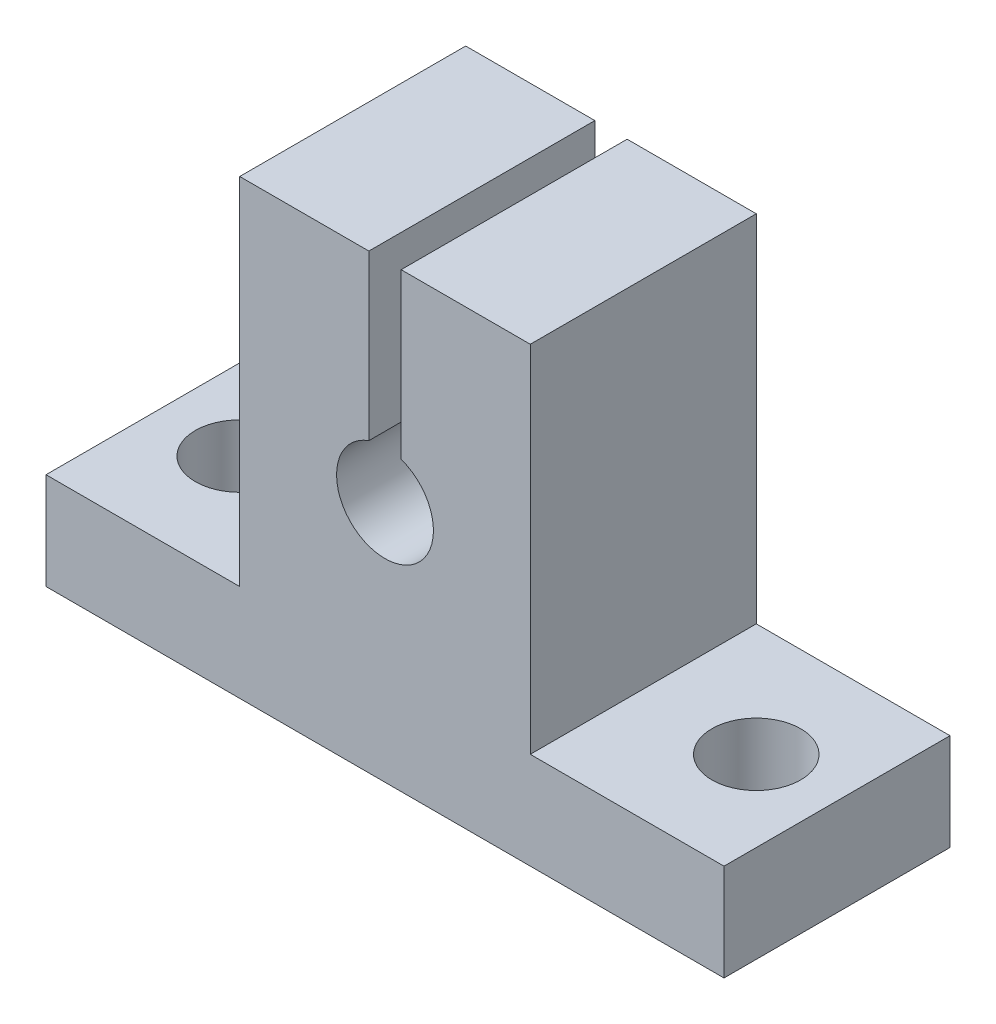
ISO-10303-21;
HEADER;
FILE_DESCRIPTION(('STEP AP214'),'2;1');
FILE_NAME('part.step','',(''),(''),'','','');
FILE_SCHEMA(('AUTOMOTIVE_DESIGN { 1 0 10303 214 1 1 1 1 }'));
ENDSEC;
DATA;
#1=APPLICATION_CONTEXT('core data for automotive mechanical design processes');
#2=APPLICATION_PROTOCOL_DEFINITION('international standard','automotive_design',2000,#1);
#3=PRODUCT_CONTEXT('',#1,'mechanical');
#4=PRODUCT('Part','Part','',(#3));
#5=PRODUCT_RELATED_PRODUCT_CATEGORY('part','',(#4));
#6=PRODUCT_DEFINITION_FORMATION('','',#4);
#7=PRODUCT_DEFINITION_CONTEXT('part definition',#1,'design');
#8=PRODUCT_DEFINITION('design','',#6,#7);
#9=PRODUCT_DEFINITION_SHAPE('','',#8);
#10=(LENGTH_UNIT() NAMED_UNIT(*) SI_UNIT(.MILLI.,.METRE.));
#11=(NAMED_UNIT(*) PLANE_ANGLE_UNIT() SI_UNIT($,.RADIAN.));
#12=(NAMED_UNIT(*) SI_UNIT($,.STERADIAN.) SOLID_ANGLE_UNIT());
#13=UNCERTAINTY_MEASURE_WITH_UNIT(LENGTH_MEASURE(1.E-05),#10,'distance_accuracy_value','');
#14=(GEOMETRIC_REPRESENTATION_CONTEXT(3) GLOBAL_UNCERTAINTY_ASSIGNED_CONTEXT((#13)) GLOBAL_UNIT_ASSIGNED_CONTEXT((#10,
#11,#12)) REPRESENTATION_CONTEXT('',''));
#15=CARTESIAN_POINT('',(0.,0.,0.));
#16=DIRECTION('',(0.,0.,1.));
#17=DIRECTION('',(1.,0.,0.));
#18=AXIS2_PLACEMENT_3D('',#15,#16,#17);
#19=CARTESIAN_POINT('',(-1.,0.,14.));
#20=DIRECTION('',(-1.,0.,0.));
#21=DIRECTION('',(0.,-1.,0.));
#22=AXIS2_PLACEMENT_3D('',#19,#20,#21);
#23=PLANE('',#22);
#24=DIRECTION('',(0.,1.,0.));
#25=VECTOR('',#24,1.);
#26=CARTESIAN_POINT('',(-1.,0.,0.));
#27=LINE('',#26,#25);
#28=CARTESIAN_POINT('',(-1.,-10.1715728752538,0.));
#29=VERTEX_POINT('',#28);
#30=CARTESIAN_POINT('',(-1.,0.,0.));
#31=VERTEX_POINT('',#30);
#32=EDGE_CURVE('E170',#29,#31,#27,.T.);
#33=ORIENTED_EDGE('',*,*,#32,.T.);
#34=DIRECTION('',(0.,0.,-1.));
#35=VECTOR('',#34,1.);
#36=CARTESIAN_POINT('',(-1.,0.,14.));
#37=LINE('',#36,#35);
#38=CARTESIAN_POINT('',(-1.,0.,14.));
#39=VERTEX_POINT('',#38);
#40=EDGE_CURVE('E11',#39,#31,#37,.T.);
#41=ORIENTED_EDGE('',*,*,#40,.F.);
#42=DIRECTION('',(0.,1.,0.));
#43=VECTOR('',#42,1.);
#44=CARTESIAN_POINT('',(-1.,0.,14.));
#45=LINE('',#44,#43);
#46=CARTESIAN_POINT('',(-1.,-10.1715728752538,14.));
#47=VERTEX_POINT('',#46);
#48=EDGE_CURVE('E205',#47,#39,#45,.T.);
#49=ORIENTED_EDGE('',*,*,#48,.F.);
#50=DIRECTION('',(0.,0.,-1.));
#51=VECTOR('',#50,1.);
#52=CARTESIAN_POINT('',(-1.,-10.1715728752538,14.));
#53=LINE('',#52,#51);
#54=EDGE_CURVE('E166',#47,#29,#53,.T.);
#55=ORIENTED_EDGE('',*,*,#54,.T.);
#56=EDGE_LOOP('',(#33,#41,#49,#55));
#57=FACE_BOUND('',#56,.T.);
#58=ADVANCED_FACE('F45',(#57),#23,.F.);
#59=CARTESIAN_POINT('',(-1.,0.,14.));
#60=DIRECTION('',(0.,-1.,0.));
#61=DIRECTION('',(1.,0.,0.));
#62=AXIS2_PLACEMENT_3D('',#59,#60,#61);
#63=PLANE('',#62);
#64=DIRECTION('',(-1.,0.,0.));
#65=VECTOR('',#64,1.);
#66=CARTESIAN_POINT('',(-1.,0.,0.));
#67=LINE('',#66,#65);
#68=CARTESIAN_POINT('',(-9.,0.,0.));
#69=VERTEX_POINT('',#68);
#70=EDGE_CURVE('E174',#31,#69,#67,.T.);
#71=ORIENTED_EDGE('',*,*,#70,.T.);
#72=DIRECTION('',(0.,0.,-1.));
#73=VECTOR('',#72,1.);
#74=CARTESIAN_POINT('',(-9.,0.,14.));
#75=LINE('',#74,#73);
#76=CARTESIAN_POINT('',(-9.,0.,14.));
#77=VERTEX_POINT('',#76);
#78=EDGE_CURVE('E54',#77,#69,#75,.T.);
#79=ORIENTED_EDGE('',*,*,#78,.F.);
#80=DIRECTION('',(-1.,0.,0.));
#81=VECTOR('',#80,1.);
#82=CARTESIAN_POINT('',(-1.,0.,14.));
#83=LINE('',#82,#81);
#84=EDGE_CURVE('E117',#39,#77,#83,.T.);
#85=ORIENTED_EDGE('',*,*,#84,.F.);
#86=ORIENTED_EDGE('',*,*,#40,.T.);
#87=EDGE_LOOP('',(#71,#79,#85,#86));
#88=FACE_BOUND('',#87,.T.);
#89=ADVANCED_FACE('F299',(#88),#63,.F.);
#90=CARTESIAN_POINT('',(-9.,0.,14.));
#91=DIRECTION('',(1.,0.,0.));
#92=DIRECTION('',(0.,1.,0.));
#93=AXIS2_PLACEMENT_3D('',#90,#91,#92);
#94=PLANE('',#93);
#95=DIRECTION('',(0.,-1.,0.));
#96=VECTOR('',#95,1.);
#97=CARTESIAN_POINT('',(-9.,0.,0.));
#98=LINE('',#97,#96);
#99=CARTESIAN_POINT('',(-9.,-22.,0.));
#100=VERTEX_POINT('',#99);
#101=EDGE_CURVE('E178',#69,#100,#98,.T.);
#102=ORIENTED_EDGE('',*,*,#101,.T.);
#103=DIRECTION('',(0.,0.,-1.));
#104=VECTOR('',#103,1.);
#105=CARTESIAN_POINT('',(-9.,-22.,14.));
#106=LINE('',#105,#104);
#107=CARTESIAN_POINT('',(-9.,-22.,14.));
#108=VERTEX_POINT('',#107);
#109=EDGE_CURVE('E232',#108,#100,#106,.T.);
#110=ORIENTED_EDGE('',*,*,#109,.F.);
#111=DIRECTION('',(0.,-1.,0.));
#112=VECTOR('',#111,1.);
#113=CARTESIAN_POINT('',(-9.,0.,14.));
#114=LINE('',#113,#112);
#115=EDGE_CURVE('E242',#77,#108,#114,.T.);
#116=ORIENTED_EDGE('',*,*,#115,.F.);
#117=ORIENTED_EDGE('',*,*,#78,.T.);
#118=EDGE_LOOP('',(#102,#110,#116,#117));
#119=FACE_BOUND('',#118,.T.);
#120=ADVANCED_FACE('F240',(#119),#94,.F.);
#121=CARTESIAN_POINT('',(-9.,-22.,14.));
#122=DIRECTION('',(0.,-1.,0.));
#123=DIRECTION('',(1.,0.,0.));
#124=AXIS2_PLACEMENT_3D('',#121,#122,#123);
#125=PLANE('',#124);
#126=CARTESIAN_POINT('',(-16.,-22.,7.));
#127=DIRECTION('',(0.,1.,0.));
#128=DIRECTION('',(-1.,0.,0.));
#129=AXIS2_PLACEMENT_3D('',#126,#127,#128);
#130=CIRCLE('',#129,2.75);
#131=CARTESIAN_POINT('',(-18.75,-22.,7.));
#132=VERTEX_POINT('',#131);
#133=EDGE_CURVE('E382',#132,#132,#130,.T.);
#134=ORIENTED_EDGE('',*,*,#133,.F.);
#135=EDGE_LOOP('',(#134));
#136=FACE_BOUND('',#135,.T.);
#137=DIRECTION('',(-1.,0.,0.));
#138=VECTOR('',#137,1.);
#139=CARTESIAN_POINT('',(-9.,-22.,0.));
#140=LINE('',#139,#138);
#141=CARTESIAN_POINT('',(-21.,-22.,0.));
#142=VERTEX_POINT('',#141);
#143=EDGE_CURVE('E181',#100,#142,#140,.T.);
#144=ORIENTED_EDGE('',*,*,#143,.T.);
#145=DIRECTION('',(0.,0.,-1.));
#146=VECTOR('',#145,1.);
#147=CARTESIAN_POINT('',(-21.,-22.,14.));
#148=LINE('',#147,#146);
#149=CARTESIAN_POINT('',(-21.,-22.,14.));
#150=VERTEX_POINT('',#149);
#151=EDGE_CURVE('E228',#150,#142,#148,.T.);
#152=ORIENTED_EDGE('',*,*,#151,.F.);
#153=DIRECTION('',(-1.,0.,0.));
#154=VECTOR('',#153,1.);
#155=CARTESIAN_POINT('',(-9.,-22.,14.));
#156=LINE('',#155,#154);
#157=EDGE_CURVE('E261',#108,#150,#156,.T.);
#158=ORIENTED_EDGE('',*,*,#157,.F.);
#159=ORIENTED_EDGE('',*,*,#109,.T.);
#160=EDGE_LOOP('',(#144,#152,#158,#159));
#161=FACE_BOUND('',#160,.T.);
#162=ADVANCED_FACE('F251',(#136,#161),#125,.F.);
#163=CARTESIAN_POINT('',(-21.,-22.,14.));
#164=DIRECTION('',(1.,0.,0.));
#165=DIRECTION('',(0.,0.,-1.));
#166=AXIS2_PLACEMENT_3D('',#163,#164,#165);
#167=PLANE('',#166);
#168=DIRECTION('',(0.,-1.,0.));
#169=VECTOR('',#168,1.);
#170=CARTESIAN_POINT('',(-21.,-22.,0.));
#171=LINE('',#170,#169);
#172=CARTESIAN_POINT('',(-21.,-28.,0.));
#173=VERTEX_POINT('',#172);
#174=EDGE_CURVE('E184',#142,#173,#171,.T.);
#175=ORIENTED_EDGE('',*,*,#174,.T.);
#176=DIRECTION('',(0.,0.,-1.));
#177=VECTOR('',#176,1.);
#178=CARTESIAN_POINT('',(-21.,-28.,14.));
#179=LINE('',#178,#177);
#180=CARTESIAN_POINT('',(-21.,-28.,14.));
#181=VERTEX_POINT('',#180);
#182=EDGE_CURVE('E224',#181,#173,#179,.T.);
#183=ORIENTED_EDGE('',*,*,#182,.F.);
#184=DIRECTION('',(0.,-1.,0.));
#185=VECTOR('',#184,1.);
#186=CARTESIAN_POINT('',(-21.,-22.,14.));
#187=LINE('',#186,#185);
#188=EDGE_CURVE('E257',#150,#181,#187,.T.);
#189=ORIENTED_EDGE('',*,*,#188,.F.);
#190=ORIENTED_EDGE('',*,*,#151,.T.);
#191=EDGE_LOOP('',(#175,#183,#189,#190));
#192=FACE_BOUND('',#191,.T.);
#193=ADVANCED_FACE('F255',(#192),#167,.F.);
#194=CARTESIAN_POINT('',(-21.,-28.,14.));
#195=DIRECTION('',(0.,1.,0.));
#196=DIRECTION('',(0.,0.,1.));
#197=AXIS2_PLACEMENT_3D('',#194,#195,#196);
#198=PLANE('',#197);
#199=CARTESIAN_POINT('',(-16.,-28.,7.));
#200=DIRECTION('',(0.,1.,0.));
#201=DIRECTION('',(-1.,0.,0.));
#202=AXIS2_PLACEMENT_3D('',#199,#200,#201);
#203=CIRCLE('',#202,2.75);
#204=CARTESIAN_POINT('',(-18.75,-28.,7.));
#205=VERTEX_POINT('',#204);
#206=EDGE_CURVE('E175',#205,#205,#203,.T.);
#207=ORIENTED_EDGE('',*,*,#206,.T.);
#208=EDGE_LOOP('',(#207));
#209=FACE_BOUND('',#208,.T.);
#210=CARTESIAN_POINT('',(16.,-28.,7.00000000000001));
#211=DIRECTION('',(0.,1.,0.));
#212=DIRECTION('',(1.,0.,0.));
#213=AXIS2_PLACEMENT_3D('',#210,#211,#212);
#214=CIRCLE('',#213,2.75);
#215=CARTESIAN_POINT('',(13.25,-28.,7.00000000000001));
#216=VERTEX_POINT('',#215);
#217=EDGE_CURVE('E390',#216,#216,#214,.T.);
#218=ORIENTED_EDGE('',*,*,#217,.T.);
#219=EDGE_LOOP('',(#218));
#220=FACE_BOUND('',#219,.T.);
#221=DIRECTION('',(1.,0.,0.));
#222=VECTOR('',#221,1.);
#223=CARTESIAN_POINT('',(-21.,-28.,0.));
#224=LINE('',#223,#222);
#225=CARTESIAN_POINT('',(21.,-28.,0.));
#226=VERTEX_POINT('',#225);
#227=EDGE_CURVE('E187',#173,#226,#224,.T.);
#228=ORIENTED_EDGE('',*,*,#227,.T.);
#229=DIRECTION('',(0.,0.,-1.));
#230=VECTOR('',#229,1.);
#231=CARTESIAN_POINT('',(21.,-28.,14.));
#232=LINE('',#231,#230);
#233=CARTESIAN_POINT('',(21.,-28.,14.));
#234=VERTEX_POINT('',#233);
#235=EDGE_CURVE('E220',#234,#226,#232,.T.);
#236=ORIENTED_EDGE('',*,*,#235,.F.);
#237=DIRECTION('',(1.,0.,0.));
#238=VECTOR('',#237,1.);
#239=CARTESIAN_POINT('',(-21.,-28.,14.));
#240=LINE('',#239,#238);
#241=EDGE_CURVE('E260',#181,#234,#240,.T.);
#242=ORIENTED_EDGE('',*,*,#241,.F.);
#243=ORIENTED_EDGE('',*,*,#182,.T.);
#244=EDGE_LOOP('',(#228,#236,#242,#243));
#245=FACE_BOUND('',#244,.T.);
#246=ADVANCED_FACE('F313',(#209,#220,#245),#198,.F.);
#247=CARTESIAN_POINT('',(21.,-22.,14.));
#248=DIRECTION('',(-1.,0.,0.));
#249=DIRECTION('',(0.,0.,1.));
#250=AXIS2_PLACEMENT_3D('',#247,#248,#249);
#251=PLANE('',#250);
#252=DIRECTION('',(0.,1.,0.));
#253=VECTOR('',#252,1.);
#254=CARTESIAN_POINT('',(21.,-22.,0.));
#255=LINE('',#254,#253);
#256=CARTESIAN_POINT('',(21.,-22.,0.));
#257=VERTEX_POINT('',#256);
#258=EDGE_CURVE('E190',#226,#257,#255,.T.);
#259=ORIENTED_EDGE('',*,*,#258,.T.);
#260=DIRECTION('',(0.,0.,-1.));
#261=VECTOR('',#260,1.);
#262=CARTESIAN_POINT('',(21.,-22.,14.));
#263=LINE('',#262,#261);
#264=CARTESIAN_POINT('',(21.,-22.,14.));
#265=VERTEX_POINT('',#264);
#266=EDGE_CURVE('E216',#265,#257,#263,.T.);
#267=ORIENTED_EDGE('',*,*,#266,.F.);
#268=DIRECTION('',(0.,1.,0.));
#269=VECTOR('',#268,1.);
#270=CARTESIAN_POINT('',(21.,-22.,14.));
#271=LINE('',#270,#269);
#272=EDGE_CURVE('E265',#234,#265,#271,.T.);
#273=ORIENTED_EDGE('',*,*,#272,.F.);
#274=ORIENTED_EDGE('',*,*,#235,.T.);
#275=EDGE_LOOP('',(#259,#267,#273,#274));
#276=FACE_BOUND('',#275,.T.);
#277=ADVANCED_FACE('F316',(#276),#251,.F.);
#278=CARTESIAN_POINT('',(9.,-22.,14.));
#279=DIRECTION('',(0.,-1.,0.));
#280=DIRECTION('',(1.,0.,0.));
#281=AXIS2_PLACEMENT_3D('',#278,#279,#280);
#282=PLANE('',#281);
#283=CARTESIAN_POINT('',(16.,-22.,7.00000000000001));
#284=DIRECTION('',(0.,1.,0.));
#285=DIRECTION('',(1.,0.,0.));
#286=AXIS2_PLACEMENT_3D('',#283,#284,#285);
#287=CIRCLE('',#286,2.75);
#288=CARTESIAN_POINT('',(13.25,-22.,7.00000000000001));
#289=VERTEX_POINT('',#288);
#290=EDGE_CURVE('E384',#289,#289,#287,.T.);
#291=ORIENTED_EDGE('',*,*,#290,.F.);
#292=EDGE_LOOP('',(#291));
#293=FACE_BOUND('',#292,.T.);
#294=DIRECTION('',(-1.,0.,0.));
#295=VECTOR('',#294,1.);
#296=CARTESIAN_POINT('',(9.,-22.,0.));
#297=LINE('',#296,#295);
#298=CARTESIAN_POINT('',(9.,-22.,0.));
#299=VERTEX_POINT('',#298);
#300=EDGE_CURVE('E193',#257,#299,#297,.T.);
#301=ORIENTED_EDGE('',*,*,#300,.T.);
#302=DIRECTION('',(0.,0.,-1.));
#303=VECTOR('',#302,1.);
#304=CARTESIAN_POINT('',(9.,-22.,14.));
#305=LINE('',#304,#303);
#306=CARTESIAN_POINT('',(9.,-22.,14.));
#307=VERTEX_POINT('',#306);
#308=EDGE_CURVE('E212',#307,#299,#305,.T.);
#309=ORIENTED_EDGE('',*,*,#308,.F.);
#310=DIRECTION('',(-1.,0.,0.));
#311=VECTOR('',#310,1.);
#312=CARTESIAN_POINT('',(9.,-22.,14.));
#313=LINE('',#312,#311);
#314=EDGE_CURVE('E272',#265,#307,#313,.T.);
#315=ORIENTED_EDGE('',*,*,#314,.F.);
#316=ORIENTED_EDGE('',*,*,#266,.T.);
#317=EDGE_LOOP('',(#301,#309,#315,#316));
#318=FACE_BOUND('',#317,.T.);
#319=ADVANCED_FACE('F280',(#293,#318),#282,.F.);
#320=CARTESIAN_POINT('',(9.,0.,14.));
#321=DIRECTION('',(-1.,0.,0.));
#322=DIRECTION('',(0.,-1.,0.));
#323=AXIS2_PLACEMENT_3D('',#320,#321,#322);
#324=PLANE('',#323);
#325=DIRECTION('',(0.,1.,0.));
#326=VECTOR('',#325,1.);
#327=CARTESIAN_POINT('',(9.,0.,0.));
#328=LINE('',#327,#326);
#329=CARTESIAN_POINT('',(9.,0.,0.));
#330=VERTEX_POINT('',#329);
#331=EDGE_CURVE('E196',#299,#330,#328,.T.);
#332=ORIENTED_EDGE('',*,*,#331,.T.);
#333=DIRECTION('',(0.,0.,-1.));
#334=VECTOR('',#333,1.);
#335=CARTESIAN_POINT('',(9.,0.,14.));
#336=LINE('',#335,#334);
#337=CARTESIAN_POINT('',(9.,0.,14.));
#338=VERTEX_POINT('',#337);
#339=EDGE_CURVE('E159',#338,#330,#336,.T.);
#340=ORIENTED_EDGE('',*,*,#339,.F.);
#341=DIRECTION('',(0.,1.,0.));
#342=VECTOR('',#341,1.);
#343=CARTESIAN_POINT('',(9.,0.,14.));
#344=LINE('',#343,#342);
#345=EDGE_CURVE('E148',#307,#338,#344,.T.);
#346=ORIENTED_EDGE('',*,*,#345,.F.);
#347=ORIENTED_EDGE('',*,*,#308,.T.);
#348=EDGE_LOOP('',(#332,#340,#346,#347));
#349=FACE_BOUND('',#348,.T.);
#350=ADVANCED_FACE('F284',(#349),#324,.F.);
#351=CARTESIAN_POINT('',(1.,0.,14.));
#352=DIRECTION('',(0.,-1.,0.));
#353=DIRECTION('',(1.,0.,0.));
#354=AXIS2_PLACEMENT_3D('',#351,#352,#353);
#355=PLANE('',#354);
#356=DIRECTION('',(-1.,0.,0.));
#357=VECTOR('',#356,1.);
#358=CARTESIAN_POINT('',(1.,0.,0.));
#359=LINE('',#358,#357);
#360=CARTESIAN_POINT('',(1.,0.,0.));
#361=VERTEX_POINT('',#360);
#362=EDGE_CURVE('E157',#330,#361,#359,.T.);
#363=ORIENTED_EDGE('',*,*,#362,.T.);
#364=DIRECTION('',(0.,0.,-1.));
#365=VECTOR('',#364,1.);
#366=CARTESIAN_POINT('',(1.,0.,14.));
#367=LINE('',#366,#365);
#368=CARTESIAN_POINT('',(1.,0.,14.));
#369=VERTEX_POINT('',#368);
#370=EDGE_CURVE('E154',#369,#361,#367,.T.);
#371=ORIENTED_EDGE('',*,*,#370,.F.);
#372=DIRECTION('',(-1.,0.,0.));
#373=VECTOR('',#372,1.);
#374=CARTESIAN_POINT('',(1.,0.,14.));
#375=LINE('',#374,#373);
#376=EDGE_CURVE('E142',#338,#369,#375,.T.);
#377=ORIENTED_EDGE('',*,*,#376,.F.);
#378=ORIENTED_EDGE('',*,*,#339,.T.);
#379=EDGE_LOOP('',(#363,#371,#377,#378));
#380=FACE_BOUND('',#379,.T.);
#381=ADVANCED_FACE('F155',(#380),#355,.F.);
#382=CARTESIAN_POINT('',(1.,0.,14.));
#383=DIRECTION('',(1.,0.,0.));
#384=DIRECTION('',(0.,1.,0.));
#385=AXIS2_PLACEMENT_3D('',#382,#383,#384);
#386=PLANE('',#385);
#387=DIRECTION('',(0.,-1.,0.));
#388=VECTOR('',#387,1.);
#389=CARTESIAN_POINT('',(1.,0.,0.));
#390=LINE('',#389,#388);
#391=CARTESIAN_POINT('',(1.,-10.1715728752538,0.));
#392=VERTEX_POINT('',#391);
#393=EDGE_CURVE('E103',#361,#392,#390,.T.);
#394=ORIENTED_EDGE('',*,*,#393,.T.);
#395=DIRECTION('',(0.,0.,-1.));
#396=VECTOR('',#395,1.);
#397=CARTESIAN_POINT('',(1.,-10.1715728752538,14.));
#398=LINE('',#397,#396);
#399=CARTESIAN_POINT('',(1.,-10.1715728752538,14.));
#400=VERTEX_POINT('',#399);
#401=EDGE_CURVE('E160',#400,#392,#398,.T.);
#402=ORIENTED_EDGE('',*,*,#401,.F.);
#403=DIRECTION('',(0.,-1.,0.));
#404=VECTOR('',#403,1.);
#405=CARTESIAN_POINT('',(1.,0.,14.));
#406=LINE('',#405,#404);
#407=EDGE_CURVE('E146',#369,#400,#406,.T.);
#408=ORIENTED_EDGE('',*,*,#407,.F.);
#409=ORIENTED_EDGE('',*,*,#370,.T.);
#410=EDGE_LOOP('',(#394,#402,#408,#409));
#411=FACE_BOUND('',#410,.T.);
#412=ADVANCED_FACE('F162',(#411),#386,.F.);
#413=CARTESIAN_POINT('',(0.,-13.,14.));
#414=DIRECTION('',(0.,0.,-1.));
#415=DIRECTION('',(-1.,0.,0.));
#416=AXIS2_PLACEMENT_3D('',#413,#414,#415);
#417=CYLINDRICAL_SURFACE('',#416,3.);
#418=CARTESIAN_POINT('',(0.,-13.,0.));
#419=DIRECTION('',(0.,0.,-1.));
#420=DIRECTION('',(1.,0.,0.));
#421=AXIS2_PLACEMENT_3D('',#418,#419,#420);
#422=CIRCLE('',#421,3.);
#423=EDGE_CURVE('E109',#392,#29,#422,.T.);
#424=ORIENTED_EDGE('',*,*,#423,.T.);
#425=ORIENTED_EDGE('',*,*,#54,.F.);
#426=CARTESIAN_POINT('',(0.,-13.,14.));
#427=DIRECTION('',(0.,0.,-1.));
#428=DIRECTION('',(1.,0.,0.));
#429=AXIS2_PLACEMENT_3D('',#426,#427,#428);
#430=CIRCLE('',#429,3.);
#431=EDGE_CURVE('E62',#400,#47,#430,.T.);
#432=ORIENTED_EDGE('',*,*,#431,.F.);
#433=ORIENTED_EDGE('',*,*,#401,.T.);
#434=EDGE_LOOP('',(#424,#425,#432,#433));
#435=FACE_BOUND('',#434,.T.);
#436=ADVANCED_FACE('F288',(#435),#417,.F.);
#437=CARTESIAN_POINT('',(0.,-13.,14.));
#438=DIRECTION('',(0.,0.,1.));
#439=DIRECTION('',(1.,0.,0.));
#440=AXIS2_PLACEMENT_3D('',#437,#438,#439);
#441=PLANE('',#440);
#442=ORIENTED_EDGE('',*,*,#48,.T.);
#443=ORIENTED_EDGE('',*,*,#84,.T.);
#444=ORIENTED_EDGE('',*,*,#115,.T.);
#445=ORIENTED_EDGE('',*,*,#157,.T.);
#446=ORIENTED_EDGE('',*,*,#188,.T.);
#447=ORIENTED_EDGE('',*,*,#241,.T.);
#448=ORIENTED_EDGE('',*,*,#272,.T.);
#449=ORIENTED_EDGE('',*,*,#314,.T.);
#450=ORIENTED_EDGE('',*,*,#345,.T.);
#451=ORIENTED_EDGE('',*,*,#376,.T.);
#452=ORIENTED_EDGE('',*,*,#407,.T.);
#453=ORIENTED_EDGE('',*,*,#431,.T.);
#454=EDGE_LOOP('',(#442,#443,#444,#445,#446,#447,#448,#449,#450,#451,#452,#453));
#455=FACE_BOUND('',#454,.T.);
#456=ADVANCED_FACE('F144',(#455),#441,.T.);
#457=CARTESIAN_POINT('',(0.,-13.,0.));
#458=DIRECTION('',(0.,0.,1.));
#459=DIRECTION('',(1.,0.,0.));
#460=AXIS2_PLACEMENT_3D('',#457,#458,#459);
#461=PLANE('',#460);
#462=ORIENTED_EDGE('',*,*,#32,.F.);
#463=ORIENTED_EDGE('',*,*,#423,.F.);
#464=ORIENTED_EDGE('',*,*,#393,.F.);
#465=ORIENTED_EDGE('',*,*,#362,.F.);
#466=ORIENTED_EDGE('',*,*,#331,.F.);
#467=ORIENTED_EDGE('',*,*,#300,.F.);
#468=ORIENTED_EDGE('',*,*,#258,.F.);
#469=ORIENTED_EDGE('',*,*,#227,.F.);
#470=ORIENTED_EDGE('',*,*,#174,.F.);
#471=ORIENTED_EDGE('',*,*,#143,.F.);
#472=ORIENTED_EDGE('',*,*,#101,.F.);
#473=ORIENTED_EDGE('',*,*,#70,.F.);
#474=EDGE_LOOP('',(#462,#463,#464,#465,#466,#467,#468,#469,#470,#471,#472,#473));
#475=FACE_BOUND('',#474,.T.);
#476=ADVANCED_FACE('F246',(#475),#461,.F.);
#477=CARTESIAN_POINT('',(16.,-28.,7.00000000000001));
#478=DIRECTION('',(0.,1.,0.));
#479=DIRECTION('',(-1.,0.,0.));
#480=AXIS2_PLACEMENT_3D('',#477,#478,#479);
#481=CYLINDRICAL_SURFACE('',#480,2.75);
#482=CARTESIAN_POINT('',(13.25,-28.,7.00000000000001));
#483=CARTESIAN_POINT('',(13.25,-27.9375,7.00000000000001));
#484=CARTESIAN_POINT('',(13.25,-27.875,7.00000000000001));
#485=CARTESIAN_POINT('',(13.25,-27.75,7.00000000000001));
#486=CARTESIAN_POINT('',(13.25,-27.6875,7.00000000000001));
#487=CARTESIAN_POINT('',(13.25,-27.5625,7.00000000000001));
#488=CARTESIAN_POINT('',(13.25,-27.5,7.00000000000001));
#489=CARTESIAN_POINT('',(13.25,-27.375,7.00000000000001));
#490=CARTESIAN_POINT('',(13.25,-27.3125,7.00000000000001));
#491=CARTESIAN_POINT('',(13.25,-27.1875,7.00000000000001));
#492=CARTESIAN_POINT('',(13.25,-27.125,7.00000000000001));
#493=CARTESIAN_POINT('',(13.25,-27.,7.00000000000001));
#494=CARTESIAN_POINT('',(13.25,-26.9375,7.00000000000001));
#495=CARTESIAN_POINT('',(13.25,-26.8125,7.00000000000001));
#496=CARTESIAN_POINT('',(13.25,-26.75,7.00000000000001));
#497=CARTESIAN_POINT('',(13.25,-26.625,7.00000000000001));
#498=CARTESIAN_POINT('',(13.25,-26.5625,7.00000000000001));
#499=CARTESIAN_POINT('',(13.25,-26.4375,7.00000000000001));
#500=CARTESIAN_POINT('',(13.25,-26.375,7.00000000000001));
#501=CARTESIAN_POINT('',(13.25,-26.25,7.00000000000001));
#502=CARTESIAN_POINT('',(13.25,-26.1875,7.00000000000001));
#503=CARTESIAN_POINT('',(13.25,-26.0625,7.00000000000001));
#504=CARTESIAN_POINT('',(13.25,-26.,7.00000000000001));
#505=CARTESIAN_POINT('',(13.25,-25.875,7.00000000000001));
#506=CARTESIAN_POINT('',(13.25,-25.8125,7.00000000000001));
#507=CARTESIAN_POINT('',(13.25,-25.6875,7.00000000000001));
#508=CARTESIAN_POINT('',(13.25,-25.625,7.00000000000001));
#509=CARTESIAN_POINT('',(13.25,-25.5,7.00000000000001));
#510=CARTESIAN_POINT('',(13.25,-25.4375,7.00000000000001));
#511=CARTESIAN_POINT('',(13.25,-25.3125,7.00000000000001));
#512=CARTESIAN_POINT('',(13.25,-25.25,7.00000000000001));
#513=CARTESIAN_POINT('',(13.25,-25.125,7.00000000000001));
#514=CARTESIAN_POINT('',(13.25,-25.0625,7.00000000000001));
#515=CARTESIAN_POINT('',(13.25,-24.9375,7.00000000000001));
#516=CARTESIAN_POINT('',(13.25,-24.875,7.00000000000001));
#517=CARTESIAN_POINT('',(13.25,-24.75,7.00000000000001));
#518=CARTESIAN_POINT('',(13.25,-24.6875,7.00000000000001));
#519=CARTESIAN_POINT('',(13.25,-24.5625,7.00000000000001));
#520=CARTESIAN_POINT('',(13.25,-24.5,7.00000000000001));
#521=CARTESIAN_POINT('',(13.25,-24.375,7.00000000000001));
#522=CARTESIAN_POINT('',(13.25,-24.3125,7.00000000000001));
#523=CARTESIAN_POINT('',(13.25,-24.1875,7.00000000000001));
#524=CARTESIAN_POINT('',(13.25,-24.125,7.00000000000001));
#525=CARTESIAN_POINT('',(13.25,-24.,7.00000000000001));
#526=CARTESIAN_POINT('',(13.25,-23.9375,7.00000000000001));
#527=CARTESIAN_POINT('',(13.25,-23.8125,7.00000000000001));
#528=CARTESIAN_POINT('',(13.25,-23.75,7.00000000000001));
#529=CARTESIAN_POINT('',(13.25,-23.625,7.00000000000001));
#530=CARTESIAN_POINT('',(13.25,-23.5625,7.00000000000001));
#531=CARTESIAN_POINT('',(13.25,-23.4375,7.00000000000001));
#532=CARTESIAN_POINT('',(13.25,-23.375,7.00000000000001));
#533=CARTESIAN_POINT('',(13.25,-23.25,7.00000000000001));
#534=CARTESIAN_POINT('',(13.25,-23.1875,7.00000000000001));
#535=CARTESIAN_POINT('',(13.25,-23.0625,7.00000000000001));
#536=CARTESIAN_POINT('',(13.25,-23.,7.00000000000001));
#537=CARTESIAN_POINT('',(13.25,-22.875,7.00000000000001));
#538=CARTESIAN_POINT('',(13.25,-22.8125,7.00000000000001));
#539=CARTESIAN_POINT('',(13.25,-22.6875,7.00000000000001));
#540=CARTESIAN_POINT('',(13.25,-22.625,7.00000000000001));
#541=CARTESIAN_POINT('',(13.25,-22.5,7.00000000000001));
#542=CARTESIAN_POINT('',(13.25,-22.4375,7.00000000000001));
#543=CARTESIAN_POINT('',(13.25,-22.3125,7.00000000000001));
#544=CARTESIAN_POINT('',(13.25,-22.25,7.00000000000001));
#545=CARTESIAN_POINT('',(13.25,-22.125,7.00000000000001));
#546=CARTESIAN_POINT('',(13.25,-22.0625,7.00000000000001));
#547=CARTESIAN_POINT('',(13.25,-22.,7.00000000000001));
#548=B_SPLINE_CURVE_WITH_KNOTS('',3,(#482,#483,#484,#485,#486,#487,#488,#489,#490,#491,#492,
#493,#494,#495,#496,#497,#498,#499,#500,#501,#502,#503,#504,#505,#506,#507,#508,#509,#510,#511,
#512,#513,#514,#515,#516,#517,#518,#519,#520,#521,#522,#523,#524,#525,#526,#527,#528,#529,#530,
#531,#532,#533,#534,#535,#536,#537,#538,#539,#540,#541,#542,#543,#544,#545,#546,#547),
.UNSPECIFIED.,.F.,.F.,(4,2,2,2,2,2,2,2,2,2,2,2,2,2,2,2,2,2,2,2,2,2,2,2,2,2,2,2,2,2,2,2,4),(0.,
0.1875,0.375,0.5625,0.750000000000001,0.937500000000001,1.125,1.3125,1.5,1.6875,1.875,2.0625,
2.25,2.4375,2.62500000000001,2.81250000000001,3.00000000000001,3.18750000000001,
3.37500000000001,3.56250000000001,3.75000000000001,3.93750000000001,4.12500000000001,
4.31250000000001,4.50000000000001,4.68750000000001,4.87500000000001,5.06250000000001,
5.25000000000001,5.43750000000001,5.62500000000001,5.81250000000001,6.00000000000001),.UNSPECIFIED.);
#549=EDGE_CURVE('BSEAM356',#216,#289,#548,.T.);
#550=ORIENTED_EDGE('',*,*,#217,.F.);
#551=ORIENTED_EDGE('',*,*,#290,.T.);
#552=ORIENTED_EDGE('',*,*,#549,.T.);
#553=ORIENTED_EDGE('',*,*,#549,.F.);
#554=EDGE_LOOP('',(#550,#552,#551,#553));
#555=FACE_BOUND('',#554,.T.);
#556=ADVANCED_FACE('F356',(#555),#481,.F.);
#557=CARTESIAN_POINT('',(-16.,-28.,7.));
#558=DIRECTION('',(0.,1.,0.));
#559=DIRECTION('',(-1.,0.,0.));
#560=AXIS2_PLACEMENT_3D('',#557,#558,#559);
#561=CYLINDRICAL_SURFACE('',#560,2.75);
#562=CARTESIAN_POINT('',(-18.75,-28.,7.));
#563=CARTESIAN_POINT('',(-18.75,-27.9375,7.));
#564=CARTESIAN_POINT('',(-18.75,-27.875,7.));
#565=CARTESIAN_POINT('',(-18.75,-27.75,7.));
#566=CARTESIAN_POINT('',(-18.75,-27.6875,7.));
#567=CARTESIAN_POINT('',(-18.75,-27.5625,7.));
#568=CARTESIAN_POINT('',(-18.75,-27.5,7.));
#569=CARTESIAN_POINT('',(-18.75,-27.375,7.));
#570=CARTESIAN_POINT('',(-18.75,-27.3125,7.));
#571=CARTESIAN_POINT('',(-18.75,-27.1875,7.));
#572=CARTESIAN_POINT('',(-18.75,-27.125,7.));
#573=CARTESIAN_POINT('',(-18.75,-27.,7.));
#574=CARTESIAN_POINT('',(-18.75,-26.9375,7.));
#575=CARTESIAN_POINT('',(-18.75,-26.8125,7.));
#576=CARTESIAN_POINT('',(-18.75,-26.75,7.));
#577=CARTESIAN_POINT('',(-18.75,-26.625,7.));
#578=CARTESIAN_POINT('',(-18.75,-26.5625,7.));
#579=CARTESIAN_POINT('',(-18.75,-26.4375,7.));
#580=CARTESIAN_POINT('',(-18.75,-26.375,7.));
#581=CARTESIAN_POINT('',(-18.75,-26.25,7.));
#582=CARTESIAN_POINT('',(-18.75,-26.1875,7.));
#583=CARTESIAN_POINT('',(-18.75,-26.0625,7.));
#584=CARTESIAN_POINT('',(-18.75,-26.,7.));
#585=CARTESIAN_POINT('',(-18.75,-25.875,7.));
#586=CARTESIAN_POINT('',(-18.75,-25.8125,7.));
#587=CARTESIAN_POINT('',(-18.75,-25.6875,7.));
#588=CARTESIAN_POINT('',(-18.75,-25.625,7.));
#589=CARTESIAN_POINT('',(-18.75,-25.5,7.));
#590=CARTESIAN_POINT('',(-18.75,-25.4375,7.));
#591=CARTESIAN_POINT('',(-18.75,-25.3125,7.));
#592=CARTESIAN_POINT('',(-18.75,-25.25,7.));
#593=CARTESIAN_POINT('',(-18.75,-25.125,7.));
#594=CARTESIAN_POINT('',(-18.75,-25.0625,7.));
#595=CARTESIAN_POINT('',(-18.75,-24.9375,7.));
#596=CARTESIAN_POINT('',(-18.75,-24.875,7.));
#597=CARTESIAN_POINT('',(-18.75,-24.75,7.));
#598=CARTESIAN_POINT('',(-18.75,-24.6875,7.));
#599=CARTESIAN_POINT('',(-18.75,-24.5625,7.));
#600=CARTESIAN_POINT('',(-18.75,-24.5,7.));
#601=CARTESIAN_POINT('',(-18.75,-24.375,7.));
#602=CARTESIAN_POINT('',(-18.75,-24.3125,7.));
#603=CARTESIAN_POINT('',(-18.75,-24.1875,7.));
#604=CARTESIAN_POINT('',(-18.75,-24.125,7.));
#605=CARTESIAN_POINT('',(-18.75,-24.,7.));
#606=CARTESIAN_POINT('',(-18.75,-23.9375,7.));
#607=CARTESIAN_POINT('',(-18.75,-23.8125,7.));
#608=CARTESIAN_POINT('',(-18.75,-23.75,7.));
#609=CARTESIAN_POINT('',(-18.75,-23.625,7.));
#610=CARTESIAN_POINT('',(-18.75,-23.5625,7.));
#611=CARTESIAN_POINT('',(-18.75,-23.4375,7.));
#612=CARTESIAN_POINT('',(-18.75,-23.375,7.));
#613=CARTESIAN_POINT('',(-18.75,-23.25,7.));
#614=CARTESIAN_POINT('',(-18.75,-23.1875,7.));
#615=CARTESIAN_POINT('',(-18.75,-23.0625,7.));
#616=CARTESIAN_POINT('',(-18.75,-23.,7.));
#617=CARTESIAN_POINT('',(-18.75,-22.875,7.));
#618=CARTESIAN_POINT('',(-18.75,-22.8125,7.));
#619=CARTESIAN_POINT('',(-18.75,-22.6875,7.));
#620=CARTESIAN_POINT('',(-18.75,-22.625,7.));
#621=CARTESIAN_POINT('',(-18.75,-22.5,7.));
#622=CARTESIAN_POINT('',(-18.75,-22.4375,7.));
#623=CARTESIAN_POINT('',(-18.75,-22.3125,7.));
#624=CARTESIAN_POINT('',(-18.75,-22.25,7.));
#625=CARTESIAN_POINT('',(-18.75,-22.125,7.));
#626=CARTESIAN_POINT('',(-18.75,-22.0625,7.));
#627=CARTESIAN_POINT('',(-18.75,-22.,7.));
#628=B_SPLINE_CURVE_WITH_KNOTS('',3,(#562,#563,#564,#565,#566,#567,#568,#569,#570,#571,#572,
#573,#574,#575,#576,#577,#578,#579,#580,#581,#582,#583,#584,#585,#586,#587,#588,#589,#590,#591,
#592,#593,#594,#595,#596,#597,#598,#599,#600,#601,#602,#603,#604,#605,#606,#607,#608,#609,#610,
#611,#612,#613,#614,#615,#616,#617,#618,#619,#620,#621,#622,#623,#624,#625,#626,#627),
.UNSPECIFIED.,.F.,.F.,(4,2,2,2,2,2,2,2,2,2,2,2,2,2,2,2,2,2,2,2,2,2,2,2,2,2,2,2,2,2,2,2,4),(0.,
0.1875,0.375,0.5625,0.750000000000001,0.937500000000001,1.125,1.3125,1.5,1.6875,1.875,2.0625,
2.25,2.4375,2.62500000000001,2.81250000000001,3.00000000000001,3.18750000000001,
3.37500000000001,3.56250000000001,3.75000000000001,3.93750000000001,4.12500000000001,
4.31250000000001,4.50000000000001,4.68750000000001,4.87500000000001,5.06250000000001,
5.25000000000001,5.43750000000001,5.62500000000001,5.81250000000001,6.00000000000001),.UNSPECIFIED.);
#629=EDGE_CURVE('BSEAM364',#205,#132,#628,.T.);
#630=ORIENTED_EDGE('',*,*,#206,.F.);
#631=ORIENTED_EDGE('',*,*,#133,.T.);
#632=ORIENTED_EDGE('',*,*,#629,.T.);
#633=ORIENTED_EDGE('',*,*,#629,.F.);
#634=EDGE_LOOP('',(#630,#632,#631,#633));
#635=FACE_BOUND('',#634,.T.);
#636=ADVANCED_FACE('F364',(#635),#561,.F.);
#637=CLOSED_SHELL('',(#58,#89,#120,#162,#193,#246,#277,#319,#350,#381,#412,#436,#456,#476,#556,#636));
#638=MANIFOLD_SOLID_BREP('B2',#637);
#639=ADVANCED_BREP_SHAPE_REPRESENTATION('',(#18,#638),#14);
#640=SHAPE_DEFINITION_REPRESENTATION(#9,#639);
ENDSEC;
END-ISO-10303-21;
